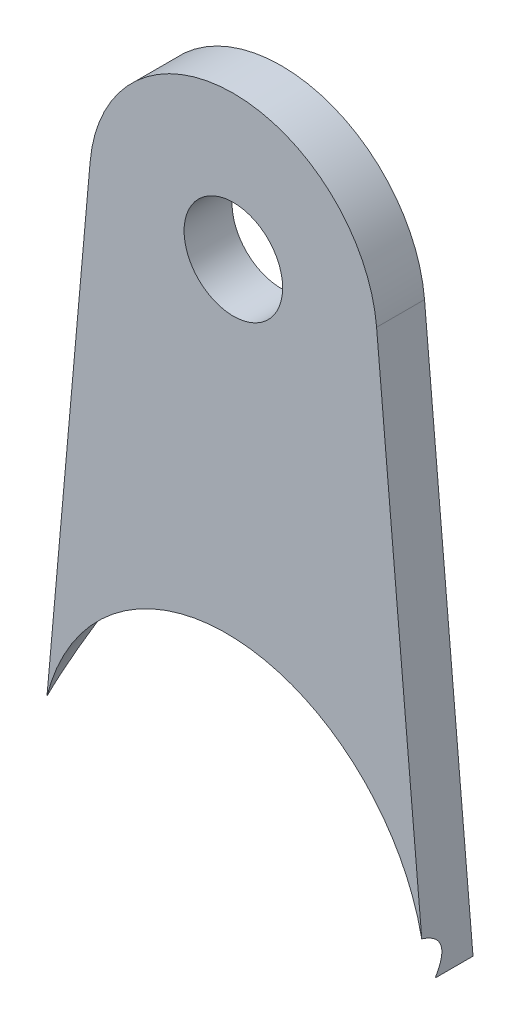
ISO-10303-21;
HEADER;
FILE_DESCRIPTION(('STEP AP214'),'2;1');
FILE_NAME('part.step','',(''),(''),'','','');
FILE_SCHEMA(('AUTOMOTIVE_DESIGN { 1 0 10303 214 1 1 1 1 }'));
ENDSEC;
DATA;
#1=APPLICATION_CONTEXT('core data for automotive mechanical design processes');
#2=APPLICATION_PROTOCOL_DEFINITION('international standard','automotive_design',2000,#1);
#3=PRODUCT_CONTEXT('',#1,'mechanical');
#4=PRODUCT('Part','Part','',(#3));
#5=PRODUCT_RELATED_PRODUCT_CATEGORY('part','',(#4));
#6=PRODUCT_DEFINITION_FORMATION('','',#4);
#7=PRODUCT_DEFINITION_CONTEXT('part definition',#1,'design');
#8=PRODUCT_DEFINITION('design','',#6,#7);
#9=PRODUCT_DEFINITION_SHAPE('','',#8);
#10=(LENGTH_UNIT() NAMED_UNIT(*) SI_UNIT(.MILLI.,.METRE.));
#11=(NAMED_UNIT(*) PLANE_ANGLE_UNIT() SI_UNIT($,.RADIAN.));
#12=(NAMED_UNIT(*) SI_UNIT($,.STERADIAN.) SOLID_ANGLE_UNIT());
#13=UNCERTAINTY_MEASURE_WITH_UNIT(LENGTH_MEASURE(1.E-05),#10,'distance_accuracy_value','');
#14=(GEOMETRIC_REPRESENTATION_CONTEXT(3) GLOBAL_UNCERTAINTY_ASSIGNED_CONTEXT((#13)) GLOBAL_UNIT_ASSIGNED_CONTEXT((#10,
#11,#12)) REPRESENTATION_CONTEXT('',''));
#15=CARTESIAN_POINT('',(0.,0.,0.));
#16=DIRECTION('',(0.,0.,1.));
#17=DIRECTION('',(1.,0.,0.));
#18=AXIS2_PLACEMENT_3D('',#15,#16,#17);
#19=CARTESIAN_POINT('',(0.,-35.211766,-3.175));
#20=DIRECTION('',(0.,1.,0.));
#21=DIRECTION('',(0.,0.,-1.));
#22=AXIS2_PLACEMENT_3D('',#19,#20,#21);
#23=PLANE('',#22);
#24=CARTESIAN_POINT('',(0.021238699381379,-35.211766,0.197331231374442));
#25=DIRECTION('',(0.,-1.,0.));
#26=DIRECTION('',(0.107011655738522,0.,0.994257766143217));
#27=AXIS2_PLACEMENT_3D('',#24,#25,#26);
#28=ELLIPSE('',#27,38.5065098354471,12.7);
#29=CARTESIAN_POINT('',(12.7,-35.211766,-0.671766563574028));
#30=VERTEX_POINT('',#29);
#31=CARTESIAN_POINT('',(12.4139168233686,-35.211766,-3.175));
#32=VERTEX_POINT('',#31);
#33=EDGE_CURVE('E11',#30,#32,#28,.F.);
#34=ORIENTED_EDGE('',*,*,#33,.T.);
#35=DIRECTION('',(1.,0.,0.));
#36=VECTOR('',#35,1.);
#37=CARTESIAN_POINT('',(0.,-35.211766,-3.175));
#38=LINE('',#37,#36);
#39=CARTESIAN_POINT('',(12.7,-35.211766,-3.175));
#40=VERTEX_POINT('',#39);
#41=EDGE_CURVE('E46',#32,#40,#38,.T.);
#42=ORIENTED_EDGE('',*,*,#41,.T.);
#43=DIRECTION('',(0.,0.,1.));
#44=VECTOR('',#43,1.);
#45=CARTESIAN_POINT('',(12.7,-35.211766,-3.175));
#46=LINE('',#45,#44);
#47=EDGE_CURVE('E105',#40,#30,#46,.T.);
#48=ORIENTED_EDGE('',*,*,#47,.T.);
#49=EDGE_LOOP('',(#34,#42,#48));
#50=FACE_BOUND('',#49,.T.);
#51=ADVANCED_FACE('F43',(#50),#23,.F.);
#52=CARTESIAN_POINT('',(-9.48741743158892,0.8453020044828,-3.175));
#53=DIRECTION('',(-0.996054323526396,0.0887456172685354,0.));
#54=DIRECTION('',(-0.0887456172685354,-0.996054323526396,0.));
#55=AXIS2_PLACEMENT_3D('',#52,#53,#54);
#56=PLANE('',#55);
#57=DIRECTION('',(0.0887456172685355,0.996054323526396,0.));
#58=VECTOR('',#57,1.);
#59=CARTESIAN_POINT('',(-9.48741743158892,0.8453020044828,0.));
#60=LINE('',#59,#58);
#61=CARTESIAN_POINT('',(-12.3448537226062,-31.2257101702002,0.));
#62=VERTEX_POINT('',#61);
#63=CARTESIAN_POINT('',(-9.48741743158892,0.8453020044828,0.));
#64=VERTEX_POINT('',#63);
#65=EDGE_CURVE('E124',#62,#64,#60,.T.);
#66=ORIENTED_EDGE('',*,*,#65,.T.);
#67=DIRECTION('',(0.,0.,1.));
#68=VECTOR('',#67,1.);
#69=CARTESIAN_POINT('',(-9.48741743158892,0.8453020044828,-3.175));
#70=LINE('',#69,#68);
#71=CARTESIAN_POINT('',(-9.48741743158892,0.8453020044828,-3.175));
#72=VERTEX_POINT('',#71);
#73=EDGE_CURVE('E128',#72,#64,#70,.T.);
#74=ORIENTED_EDGE('',*,*,#73,.F.);
#75=DIRECTION('',(0.0887456172685355,0.996054323526396,0.));
#76=VECTOR('',#75,1.);
#77=CARTESIAN_POINT('',(-9.48741743158892,0.8453020044828,-3.175));
#78=LINE('',#77,#76);
#79=CARTESIAN_POINT('',(-12.0834048992219,-28.2912866017126,-3.175));
#80=VERTEX_POINT('',#79);
#81=EDGE_CURVE('E119',#80,#72,#78,.T.);
#82=ORIENTED_EDGE('',*,*,#81,.F.);
#83=CARTESIAN_POINT('',(-9.83348737293409,-3.03888373819275,-91.364077317943));
#84=DIRECTION('',(0.996054323526396,-0.0887456172685354,0.));
#85=DIRECTION('',(-0.0286007605834822,-0.321006401354099,0.946645069064292));
#86=AXIS2_PLACEMENT_3D('',#83,#84,#85);
#87=ELLIPSE('',#86,97.7713697730626,12.7);
#88=EDGE_CURVE('E120',#62,#80,#87,.F.);
#89=ORIENTED_EDGE('',*,*,#88,.F.);
#90=EDGE_LOOP('',(#66,#74,#82,#89));
#91=FACE_BOUND('',#90,.T.);
#92=ADVANCED_FACE('F140',(#91),#56,.T.);
#93=CARTESIAN_POINT('',(9.48741743158892,0.845302004482802,-3.175));
#94=DIRECTION('',(-0.996054323526396,-0.0887456172685356,0.));
#95=DIRECTION('',(0.0887456172685356,-0.996054323526396,0.));
#96=AXIS2_PLACEMENT_3D('',#93,#94,#95);
#97=PLANE('',#96);
#98=CARTESIAN_POINT('',(17.9007325833019,-93.5832364403671,166.317792840108));
#99=DIRECTION('',(0.996054323526396,0.0887456172685356,0.));
#100=DIRECTION('',(0.0300262724361556,-0.337005920967523,0.941023608734883));
#101=AXIS2_PLACEMENT_3D('',#98,#99,#100);
#102=ELLIPSE('',#101,177.981531702369,12.7);
#103=CARTESIAN_POINT('',(12.4799875471145,-32.7424118879754,0.));
#104=VERTEX_POINT('',#103);
#105=EDGE_CURVE('E52',#104,#30,#102,.F.);
#106=ORIENTED_EDGE('',*,*,#105,.T.);
#107=ORIENTED_EDGE('',*,*,#47,.F.);
#108=DIRECTION('',(-0.0887456172685356,0.996054323526396,0.));
#109=VECTOR('',#108,1.);
#110=CARTESIAN_POINT('',(9.48741743158892,0.845302004482802,-3.175));
#111=LINE('',#110,#109);
#112=CARTESIAN_POINT('',(9.48741743158892,0.845302004482802,-3.175));
#113=VERTEX_POINT('',#112);
#114=EDGE_CURVE('E99',#40,#113,#111,.T.);
#115=ORIENTED_EDGE('',*,*,#114,.T.);
#116=DIRECTION('',(0.,0.,1.));
#117=VECTOR('',#116,1.);
#118=CARTESIAN_POINT('',(9.48741743158892,0.845302004482802,-3.175));
#119=LINE('',#118,#117);
#120=CARTESIAN_POINT('',(9.48741743158892,0.845302004482802,0.));
#121=VERTEX_POINT('',#120);
#122=EDGE_CURVE('E115',#113,#121,#119,.T.);
#123=ORIENTED_EDGE('',*,*,#122,.T.);
#124=DIRECTION('',(-0.0887456172685356,0.996054323526396,0.));
#125=VECTOR('',#124,1.);
#126=CARTESIAN_POINT('',(9.48741743158892,0.845302004482802,0.));
#127=LINE('',#126,#125);
#128=EDGE_CURVE('E110',#104,#121,#127,.T.);
#129=ORIENTED_EDGE('',*,*,#128,.F.);
#130=EDGE_LOOP('',(#106,#107,#115,#123,#129));
#131=FACE_BOUND('',#130,.T.);
#132=ADVANCED_FACE('F106',(#131),#97,.F.);
#133=CARTESIAN_POINT('',(0.,0.,-3.175));
#134=DIRECTION('',(0.,0.,1.));
#135=DIRECTION('',(-1.,0.,0.));
#136=AXIS2_PLACEMENT_3D('',#133,#134,#135);
#137=CYLINDRICAL_SURFACE('',#136,9.525);
#138=CARTESIAN_POINT('',(0.,0.,0.));
#139=DIRECTION('',(0.,0.,1.));
#140=DIRECTION('',(1.,0.,0.));
#141=AXIS2_PLACEMENT_3D('',#138,#139,#140);
#142=CIRCLE('',#141,9.525);
#143=EDGE_CURVE('E109',#121,#64,#142,.T.);
#144=ORIENTED_EDGE('',*,*,#143,.F.);
#145=ORIENTED_EDGE('',*,*,#122,.F.);
#146=CARTESIAN_POINT('',(0.,0.,-3.175));
#147=DIRECTION('',(0.,0.,1.));
#148=DIRECTION('',(1.,0.,0.));
#149=AXIS2_PLACEMENT_3D('',#146,#147,#148);
#150=CIRCLE('',#149,9.525);
#151=EDGE_CURVE('E96',#113,#72,#150,.T.);
#152=ORIENTED_EDGE('',*,*,#151,.T.);
#153=ORIENTED_EDGE('',*,*,#73,.T.);
#154=EDGE_LOOP('',(#144,#145,#152,#153));
#155=FACE_BOUND('',#154,.T.);
#156=ADVANCED_FACE('F136',(#155),#137,.T.);
#157=CARTESIAN_POINT('',(0.,0.,-3.175));
#158=DIRECTION('',(0.,0.,1.));
#159=DIRECTION('',(-1.,0.,0.));
#160=AXIS2_PLACEMENT_3D('',#157,#158,#159);
#161=CYLINDRICAL_SURFACE('',#160,3.2639);
#162=CARTESIAN_POINT('',(0.,0.,-3.175));
#163=DIRECTION('',(0.,0.,1.));
#164=DIRECTION('',(1.,0.,0.));
#165=AXIS2_PLACEMENT_3D('',#162,#163,#164);
#166=CIRCLE('',#165,3.2639);
#167=CARTESIAN_POINT('',(3.2639,0.,-3.175));
#168=VERTEX_POINT('',#167);
#169=EDGE_CURVE('E112',#168,#168,#166,.T.);
#170=ORIENTED_EDGE('',*,*,#169,.F.);
#171=EDGE_LOOP('',(#170));
#172=FACE_BOUND('',#171,.T.);
#173=CARTESIAN_POINT('',(0.,0.,0.));
#174=DIRECTION('',(0.,0.,1.));
#175=DIRECTION('',(1.,0.,0.));
#176=AXIS2_PLACEMENT_3D('',#173,#174,#175);
#177=CIRCLE('',#176,3.2639);
#178=CARTESIAN_POINT('',(3.2639,0.,0.));
#179=VERTEX_POINT('',#178);
#180=EDGE_CURVE('E121',#179,#179,#177,.T.);
#181=ORIENTED_EDGE('',*,*,#180,.T.);
#182=EDGE_LOOP('',(#181));
#183=FACE_BOUND('',#182,.T.);
#184=ADVANCED_FACE('F162',(#172,#183),#161,.F.);
#185=CARTESIAN_POINT('',(0.,0.,-3.175));
#186=DIRECTION('',(0.,0.,-1.));
#187=DIRECTION('',(1.,0.,0.));
#188=AXIS2_PLACEMENT_3D('',#185,#186,#187);
#189=PLANE('',#188);
#190=ORIENTED_EDGE('',*,*,#81,.T.);
#191=ORIENTED_EDGE('',*,*,#151,.F.);
#192=ORIENTED_EDGE('',*,*,#114,.F.);
#193=ORIENTED_EDGE('',*,*,#41,.F.);
#194=CARTESIAN_POINT('',(-0.341724267624618,-34.0267949802894,-3.17500000000004));
#195=DIRECTION('',(0.,0.,1.));
#196=DIRECTION('',(0.292874167907998,-0.956150993186849,0.));
#197=AXIS2_PLACEMENT_3D('',#194,#195,#196);
#198=ELLIPSE('',#197,13.5304319459183,12.7);
#199=EDGE_CURVE('E61',#80,#32,#198,.F.);
#200=ORIENTED_EDGE('',*,*,#199,.F.);
#201=EDGE_LOOP('',(#190,#191,#192,#193,#200));
#202=FACE_BOUND('',#201,.T.);
#203=ORIENTED_EDGE('',*,*,#169,.T.);
#204=EDGE_LOOP('',(#203));
#205=FACE_BOUND('',#204,.T.);
#206=ADVANCED_FACE('F100',(#202,#205),#189,.T.);
#207=CARTESIAN_POINT('',(0.,0.,0.));
#208=DIRECTION('',(0.,0.,-1.));
#209=DIRECTION('',(1.,0.,0.));
#210=AXIS2_PLACEMENT_3D('',#207,#208,#209);
#211=PLANE('',#210);
#212=CARTESIAN_POINT('',(4.45476988630844E-12,-35.1424276775105,0.));
#213=DIRECTION('',(0.,0.,1.));
#214=DIRECTION('',(0.292874167907998,-0.956150993186849,0.));
#215=AXIS2_PLACEMENT_3D('',#212,#213,#214);
#216=ELLIPSE('',#215,13.5304319459183,12.7);
#217=EDGE_CURVE('E80',#62,#104,#216,.F.);
#218=ORIENTED_EDGE('',*,*,#217,.T.);
#219=ORIENTED_EDGE('',*,*,#128,.T.);
#220=ORIENTED_EDGE('',*,*,#143,.T.);
#221=ORIENTED_EDGE('',*,*,#65,.F.);
#222=EDGE_LOOP('',(#218,#219,#220,#221));
#223=FACE_BOUND('',#222,.T.);
#224=ORIENTED_EDGE('',*,*,#180,.F.);
#225=EDGE_LOOP('',(#224));
#226=FACE_BOUND('',#225,.T.);
#227=ADVANCED_FACE('F141',(#223,#226),#211,.F.);
#228=CARTESIAN_POINT('',(-74.2880789176671,207.387055023019,-690.219199824666));
#229=DIRECTION('',(0.101023904926304,-0.329814362669374,0.938624875448352));
#230=DIRECTION('',(0.901791923901464,-0.368117348157891,-0.226408798352222));
#231=AXIS2_PLACEMENT_3D('',#228,#229,#230);
#232=CYLINDRICAL_SURFACE('',#231,12.7);
#233=ORIENTED_EDGE('',*,*,#88,.T.);
#234=ORIENTED_EDGE('',*,*,#199,.T.);
#235=ORIENTED_EDGE('',*,*,#33,.F.);
#236=ORIENTED_EDGE('',*,*,#105,.F.);
#237=ORIENTED_EDGE('',*,*,#217,.F.);
#238=EDGE_LOOP('',(#233,#234,#235,#236,#237));
#239=FACE_BOUND('',#238,.T.);
#240=ADVANCED_FACE('F143',(#239),#232,.F.);
#241=CLOSED_SHELL('',(#51,#92,#132,#156,#184,#206,#227,#240));
#242=MANIFOLD_SOLID_BREP('B2',#241);
#243=ADVANCED_BREP_SHAPE_REPRESENTATION('',(#18,#242),#14);
#244=SHAPE_DEFINITION_REPRESENTATION(#9,#243);
ENDSEC;
END-ISO-10303-21;
